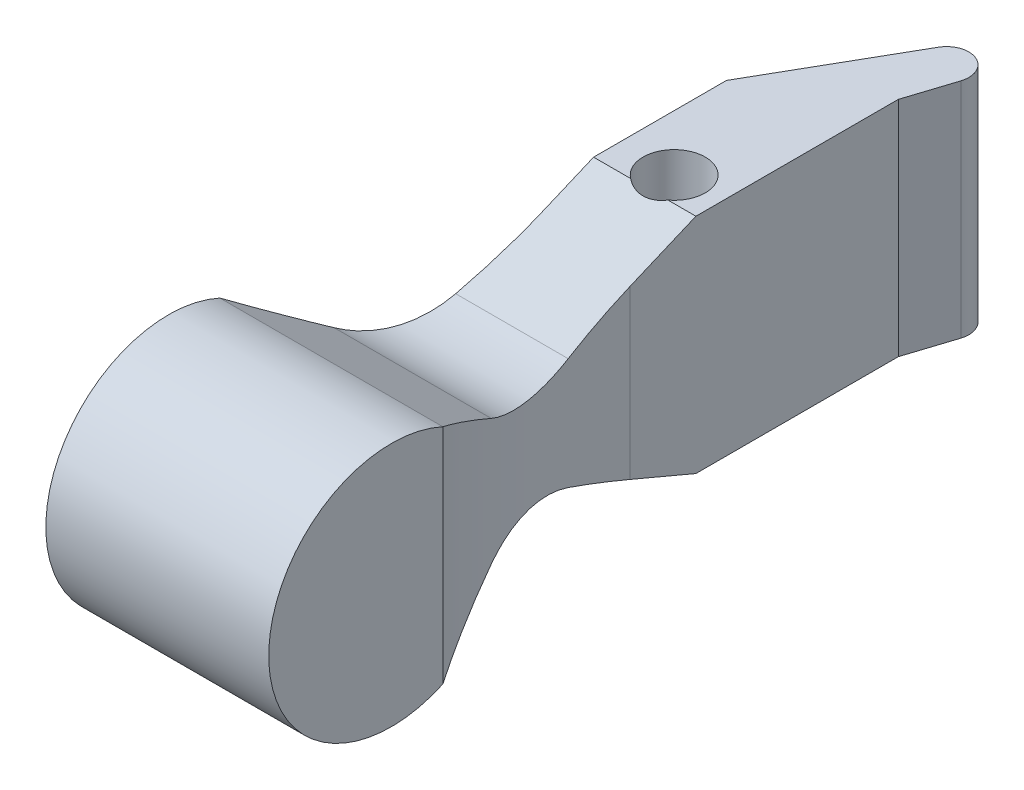
ISO-10303-21;
HEADER;
FILE_DESCRIPTION(('STEP AP214'),'2;1');
FILE_NAME('part.step','',(''),(''),'','','');
FILE_SCHEMA(('AUTOMOTIVE_DESIGN { 1 0 10303 214 1 1 1 1 }'));
ENDSEC;
DATA;
#1=APPLICATION_CONTEXT('core data for automotive mechanical design processes');
#2=APPLICATION_PROTOCOL_DEFINITION('international standard','automotive_design',2000,#1);
#3=PRODUCT_CONTEXT('',#1,'mechanical');
#4=PRODUCT('Part','Part','',(#3));
#5=PRODUCT_RELATED_PRODUCT_CATEGORY('part','',(#4));
#6=PRODUCT_DEFINITION_FORMATION('','',#4);
#7=PRODUCT_DEFINITION_CONTEXT('part definition',#1,'design');
#8=PRODUCT_DEFINITION('design','',#6,#7);
#9=PRODUCT_DEFINITION_SHAPE('','',#8);
#10=(LENGTH_UNIT() NAMED_UNIT(*) SI_UNIT(.MILLI.,.METRE.));
#11=(NAMED_UNIT(*) PLANE_ANGLE_UNIT() SI_UNIT($,.RADIAN.));
#12=(NAMED_UNIT(*) SI_UNIT($,.STERADIAN.) SOLID_ANGLE_UNIT());
#13=UNCERTAINTY_MEASURE_WITH_UNIT(LENGTH_MEASURE(1.E-05),#10,'distance_accuracy_value','');
#14=(GEOMETRIC_REPRESENTATION_CONTEXT(3) GLOBAL_UNCERTAINTY_ASSIGNED_CONTEXT((#13)) GLOBAL_UNIT_ASSIGNED_CONTEXT((#10,
#11,#12)) REPRESENTATION_CONTEXT('',''));
#15=CARTESIAN_POINT('',(0.,0.,0.));
#16=DIRECTION('',(0.,0.,1.));
#17=DIRECTION('',(1.,0.,0.));
#18=AXIS2_PLACEMENT_3D('',#15,#16,#17);
#19=CARTESIAN_POINT('',(0.999134907657391,2.,9.18637032986999));
#20=DIRECTION('',(-1.,0.,0.));
#21=DIRECTION('',(0.,0.,1.));
#22=AXIS2_PLACEMENT_3D('',#19,#20,#21);
#23=PLANE('',#22);
#24=DIRECTION('',(0.,0.389267032224823,-0.921124952231172));
#25=VECTOR('',#24,1.);
#26=CARTESIAN_POINT('',(0.999134907657391,0.00856248977380587,8.3447896435698));
#27=LINE('',#26,#25);
#28=CARTESIAN_POINT('',(0.999134907657391,1.50021824934142,4.81507552310068));
#29=VERTEX_POINT('',#28);
#30=CARTESIAN_POINT('',(0.99913490765739,2.,3.63243891868483));
#31=VERTEX_POINT('',#30);
#32=EDGE_CURVE('E134',#29,#31,#27,.T.);
#33=ORIENTED_EDGE('',*,*,#32,.F.);
#34=DIRECTION('',(0.,1.,0.));
#35=VECTOR('',#34,1.);
#36=CARTESIAN_POINT('',(0.999134907657391,2.,4.81507552310068));
#37=LINE('',#36,#35);
#38=CARTESIAN_POINT('',(0.999134907657391,-1.50021824934142,4.81507552310068));
#39=VERTEX_POINT('',#38);
#40=EDGE_CURVE('E191',#29,#39,#37,.F.);
#41=ORIENTED_EDGE('',*,*,#40,.T.);
#42=DIRECTION('',(0.,-0.389267032224823,-0.921124952231172));
#43=VECTOR('',#42,1.);
#44=CARTESIAN_POINT('',(0.999134907657391,0.59755279973468,9.77904394942284));
#45=LINE('',#44,#43);
#46=CARTESIAN_POINT('',(0.99913490765739,-2.,3.63243891868484));
#47=VERTEX_POINT('',#46);
#48=EDGE_CURVE('E122',#39,#47,#45,.T.);
#49=ORIENTED_EDGE('',*,*,#48,.T.);
#50=DIRECTION('',(0.,0.,-1.));
#51=VECTOR('',#50,1.);
#52=CARTESIAN_POINT('',(0.999134907657391,-2.,9.18637032986999));
#53=LINE('',#52,#51);
#54=CARTESIAN_POINT('',(0.999134907657391,-2.,0.));
#55=VERTEX_POINT('',#54);
#56=EDGE_CURVE('E141',#47,#55,#53,.T.);
#57=ORIENTED_EDGE('',*,*,#56,.T.);
#58=DIRECTION('',(0.,-1.,0.));
#59=VECTOR('',#58,1.);
#60=CARTESIAN_POINT('',(0.999134907657391,2.,0.));
#61=LINE('',#60,#59);
#62=CARTESIAN_POINT('',(0.999134907657391,2.,0.));
#63=VERTEX_POINT('',#62);
#64=EDGE_CURVE('E182',#63,#55,#61,.T.);
#65=ORIENTED_EDGE('',*,*,#64,.F.);
#66=DIRECTION('',(0.,0.,-1.));
#67=VECTOR('',#66,1.);
#68=CARTESIAN_POINT('',(0.999134907657391,2.,9.18637032986999));
#69=LINE('',#68,#67);
#70=EDGE_CURVE('E144',#31,#63,#69,.T.);
#71=ORIENTED_EDGE('',*,*,#70,.F.);
#72=EDGE_LOOP('',(#33,#41,#49,#57,#65,#71));
#73=FACE_BOUND('',#72,.T.);
#74=ADVANCED_FACE('F32',(#73),#23,.F.);
#75=CARTESIAN_POINT('',(-0.837048863818451,2.,1.24760947583977));
#76=DIRECTION('',(1.,0.,0.));
#77=DIRECTION('',(0.,0.,-1.));
#78=AXIS2_PLACEMENT_3D('',#75,#76,#77);
#79=PLANE('',#78);
#80=DIRECTION('',(0.,0.389267032224823,0.921124952231172));
#81=VECTOR('',#80,1.);
#82=CARTESIAN_POINT('',(-0.837048863818451,-2.,3.63243891868484));
#83=LINE('',#82,#81);
#84=CARTESIAN_POINT('',(-0.837048863818451,-2.,3.63243891868484));
#85=VERTEX_POINT('',#84);
#86=CARTESIAN_POINT('',(-0.837048863818451,-1.63534891892601,4.49531499559167));
#87=VERTEX_POINT('',#86);
#88=EDGE_CURVE('E113',#85,#87,#83,.T.);
#89=ORIENTED_EDGE('',*,*,#88,.T.);
#90=DIRECTION('',(0.,1.,0.));
#91=VECTOR('',#90,1.);
#92=CARTESIAN_POINT('',(-0.837048863818451,2.,4.49531499559167));
#93=LINE('',#92,#91);
#94=CARTESIAN_POINT('',(-0.837048863818451,1.63534891892601,4.49531499559167));
#95=VERTEX_POINT('',#94);
#96=EDGE_CURVE('E194',#87,#95,#93,.T.);
#97=ORIENTED_EDGE('',*,*,#96,.T.);
#98=DIRECTION('',(0.,-0.389267032224823,0.921124952231172));
#99=VECTOR('',#98,1.);
#100=CARTESIAN_POINT('',(-0.837048863818451,2.,3.63243891868483));
#101=LINE('',#100,#99);
#102=CARTESIAN_POINT('',(-0.837048863818451,2.,3.63243891868483));
#103=VERTEX_POINT('',#102);
#104=EDGE_CURVE('E109',#103,#95,#101,.T.);
#105=ORIENTED_EDGE('',*,*,#104,.F.);
#106=DIRECTION('',(0.,0.,1.));
#107=VECTOR('',#106,1.);
#108=CARTESIAN_POINT('',(-0.837048863818451,2.,1.24760947583977));
#109=LINE('',#108,#107);
#110=CARTESIAN_POINT('',(-0.837048863818451,2.,1.24760947583977));
#111=VERTEX_POINT('',#110);
#112=EDGE_CURVE('E157',#111,#103,#109,.T.);
#113=ORIENTED_EDGE('',*,*,#112,.F.);
#114=DIRECTION('',(0.,-1.,0.));
#115=VECTOR('',#114,1.);
#116=CARTESIAN_POINT('',(-0.837048863818451,2.,1.24760947583977));
#117=LINE('',#116,#115);
#118=CARTESIAN_POINT('',(-0.837048863818451,-2.,1.24760947583977));
#119=VERTEX_POINT('',#118);
#120=EDGE_CURVE('E160',#111,#119,#117,.T.);
#121=ORIENTED_EDGE('',*,*,#120,.T.);
#122=DIRECTION('',(0.,0.,1.));
#123=VECTOR('',#122,1.);
#124=CARTESIAN_POINT('',(-0.837048863818451,-2.,1.24760947583977));
#125=LINE('',#124,#123);
#126=EDGE_CURVE('E148',#119,#85,#125,.T.);
#127=ORIENTED_EDGE('',*,*,#126,.T.);
#128=EDGE_LOOP('',(#89,#97,#105,#113,#121,#127));
#129=FACE_BOUND('',#128,.T.);
#130=ADVANCED_FACE('F300',(#129),#79,.F.);
#131=CARTESIAN_POINT('',(0.893763052639286,2.,-0.972273036742928));
#132=DIRECTION('',(0.,1.,0.));
#133=DIRECTION('',(0.,0.,1.));
#134=AXIS2_PLACEMENT_3D('',#131,#132,#133);
#135=PLANE('',#134);
#136=ORIENTED_EDGE('',*,*,#112,.T.);
#137=DIRECTION('',(1.,0.,0.));
#138=VECTOR('',#137,1.);
#139=CARTESIAN_POINT('',(-0.837048863818451,2.,3.63243891868483));
#140=LINE('',#139,#138);
#141=CARTESIAN_POINT('',(-0.17221198150248,2.,3.63243891868483));
#142=VERTEX_POINT('',#141);
#143=EDGE_CURVE('E117',#103,#142,#140,.T.);
#144=ORIENTED_EDGE('',*,*,#143,.T.);
#145=CARTESIAN_POINT('',(0.162951136181548,2.,3.18637032986999));
#146=DIRECTION('',(0.,1.,0.));
#147=DIRECTION('',(0.,0.,1.));
#148=AXIS2_PLACEMENT_3D('',#145,#146,#147);
#149=CIRCLE('',#148,0.557952956245364);
#150=CARTESIAN_POINT('',(0.498114253865576,2.,3.63243891868483));
#151=VERTEX_POINT('',#150);
#152=EDGE_CURVE('E138',#151,#142,#149,.T.);
#153=ORIENTED_EDGE('',*,*,#152,.F.);
#154=EDGE_CURVE('E116',#151,#31,#140,.T.);
#155=ORIENTED_EDGE('',*,*,#154,.T.);
#156=ORIENTED_EDGE('',*,*,#70,.T.);
#157=DIRECTION('',(0.306685794926007,0.,-0.951810812709439));
#158=VECTOR('',#157,1.);
#159=CARTESIAN_POINT('',(1.27303719888314,2.,-0.850065985212838));
#160=LINE('',#159,#158);
#161=CARTESIAN_POINT('',(1.27303719888314,2.,-0.850065985212838));
#162=VERTEX_POINT('',#161);
#163=EDGE_CURVE('E147',#63,#162,#160,.T.);
#164=ORIENTED_EDGE('',*,*,#163,.T.);
#165=CARTESIAN_POINT('',(0.893763052639286,2.,-0.972273036742928));
#166=DIRECTION('',(0.,1.,0.));
#167=DIRECTION('',(0.,0.,1.));
#168=AXIS2_PLACEMENT_3D('',#165,#166,#167);
#169=CIRCLE('',#168,0.398476400120111);
#170=CARTESIAN_POINT('',(0.544188203910861,2.,-1.16353428893265));
#171=VERTEX_POINT('',#170);
#172=EDGE_CURVE('E151',#162,#171,#169,.T.);
#173=ORIENTED_EDGE('',*,*,#172,.T.);
#174=DIRECTION('',(-0.497072060501097,0.,0.86770926390652));
#175=VECTOR('',#174,1.);
#176=CARTESIAN_POINT('',(0.544188203910861,2.,-1.16353428893265));
#177=LINE('',#176,#175);
#178=EDGE_CURVE('E154',#171,#111,#177,.T.);
#179=ORIENTED_EDGE('',*,*,#178,.T.);
#180=EDGE_LOOP('',(#136,#144,#153,#155,#156,#164,#173,#179));
#181=FACE_BOUND('',#180,.T.);
#182=ADVANCED_FACE('F310',(#181),#135,.T.);
#183=CARTESIAN_POINT('',(0.893763052639286,-2.,-0.972273036742928));
#184=DIRECTION('',(0.,1.,0.));
#185=DIRECTION('',(0.,0.,1.));
#186=AXIS2_PLACEMENT_3D('',#183,#184,#185);
#187=PLANE('',#186);
#188=ORIENTED_EDGE('',*,*,#56,.F.);
#189=DIRECTION('',(1.,0.,0.));
#190=VECTOR('',#189,1.);
#191=CARTESIAN_POINT('',(-0.837048863818451,-2.,3.63243891868484));
#192=LINE('',#191,#190);
#193=CARTESIAN_POINT('',(0.498114253865572,-2.,3.63243891868484));
#194=VERTEX_POINT('',#193);
#195=EDGE_CURVE('E129',#194,#47,#192,.T.);
#196=ORIENTED_EDGE('',*,*,#195,.F.);
#197=CARTESIAN_POINT('',(0.162951136181548,-2.,3.18637032986999));
#198=DIRECTION('',(0.,1.,0.));
#199=DIRECTION('',(0.,0.,1.));
#200=AXIS2_PLACEMENT_3D('',#197,#198,#199);
#201=CIRCLE('',#200,0.557952956245364);
#202=CARTESIAN_POINT('',(-0.172211981502475,-2.,3.63243891868484));
#203=VERTEX_POINT('',#202);
#204=EDGE_CURVE('E137',#194,#203,#201,.T.);
#205=ORIENTED_EDGE('',*,*,#204,.T.);
#206=EDGE_CURVE('E86',#85,#203,#192,.T.);
#207=ORIENTED_EDGE('',*,*,#206,.F.);
#208=ORIENTED_EDGE('',*,*,#126,.F.);
#209=DIRECTION('',(-0.497072060501097,0.,0.86770926390652));
#210=VECTOR('',#209,1.);
#211=CARTESIAN_POINT('',(0.544188203910861,-2.,-1.16353428893265));
#212=LINE('',#211,#210);
#213=CARTESIAN_POINT('',(0.544188203910861,-2.,-1.16353428893265));
#214=VERTEX_POINT('',#213);
#215=EDGE_CURVE('E169',#214,#119,#212,.T.);
#216=ORIENTED_EDGE('',*,*,#215,.F.);
#217=CARTESIAN_POINT('',(0.893763052639286,-2.,-0.972273036742928));
#218=DIRECTION('',(0.,1.,0.));
#219=DIRECTION('',(0.,0.,1.));
#220=AXIS2_PLACEMENT_3D('',#217,#218,#219);
#221=CIRCLE('',#220,0.398476400120111);
#222=CARTESIAN_POINT('',(1.27303719888314,-2.,-0.850065985212838));
#223=VERTEX_POINT('',#222);
#224=EDGE_CURVE('E166',#223,#214,#221,.T.);
#225=ORIENTED_EDGE('',*,*,#224,.F.);
#226=DIRECTION('',(0.306685794926007,0.,-0.951810812709439));
#227=VECTOR('',#226,1.);
#228=CARTESIAN_POINT('',(1.27303719888314,-2.,-0.850065985212838));
#229=LINE('',#228,#227);
#230=EDGE_CURVE('E163',#55,#223,#229,.T.);
#231=ORIENTED_EDGE('',*,*,#230,.F.);
#232=EDGE_LOOP('',(#188,#196,#205,#207,#208,#216,#225,#231));
#233=FACE_BOUND('',#232,.T.);
#234=ADVANCED_FACE('F340',(#233),#187,.F.);
#235=CARTESIAN_POINT('',(0.162951136181548,2.,3.18637032986999));
#236=DIRECTION('',(0.,-1.,0.));
#237=DIRECTION('',(0.,0.,-1.));
#238=AXIS2_PLACEMENT_3D('',#235,#236,#237);
#239=CYLINDRICAL_SURFACE('',#238,0.557952956245364);
#240=CARTESIAN_POINT('',(0.162951136181548,-2.18850840520178,3.18637032986999));
#241=DIRECTION('',(0.,0.921124952231172,-0.389267032224823));
#242=DIRECTION('',(0.,-0.389267032224823,-0.921124952231172));
#243=AXIS2_PLACEMENT_3D('',#240,#241,#242);
#244=ELLIPSE('',#243,0.605729933701043,0.557952956245364);
#245=EDGE_CURVE('E185',#203,#194,#244,.T.);
#246=ORIENTED_EDGE('',*,*,#245,.F.);
#247=ORIENTED_EDGE('',*,*,#204,.F.);
#248=EDGE_LOOP('',(#246,#247));
#249=FACE_BOUND('',#248,.T.);
#250=ORIENTED_EDGE('',*,*,#152,.T.);
#251=CARTESIAN_POINT('',(0.162951136181548,2.18850840520178,3.18637032986999));
#252=DIRECTION('',(0.,0.921124952231172,0.389267032224823));
#253=DIRECTION('',(0.,-0.389267032224823,0.921124952231172));
#254=AXIS2_PLACEMENT_3D('',#251,#252,#253);
#255=ELLIPSE('',#254,0.605729933701043,0.557952956245364);
#256=EDGE_CURVE('E188',#142,#151,#255,.T.);
#257=ORIENTED_EDGE('',*,*,#256,.T.);
#258=EDGE_LOOP('',(#250,#257));
#259=FACE_BOUND('',#258,.T.);
#260=ADVANCED_FACE('F314',(#249,#259),#239,.F.);
#261=CARTESIAN_POINT('',(1.27303719888314,2.,-0.850065985212838));
#262=DIRECTION('',(-0.951810812709439,0.,-0.306685794926007));
#263=DIRECTION('',(-0.306685794926007,0.,0.951810812709439));
#264=AXIS2_PLACEMENT_3D('',#261,#262,#263);
#265=PLANE('',#264);
#266=ORIENTED_EDGE('',*,*,#230,.T.);
#267=DIRECTION('',(0.,-1.,0.));
#268=VECTOR('',#267,1.);
#269=CARTESIAN_POINT('',(1.27303719888314,2.,-0.850065985212838));
#270=LINE('',#269,#268);
#271=EDGE_CURVE('E179',#162,#223,#270,.T.);
#272=ORIENTED_EDGE('',*,*,#271,.F.);
#273=ORIENTED_EDGE('',*,*,#163,.F.);
#274=ORIENTED_EDGE('',*,*,#64,.T.);
#275=EDGE_LOOP('',(#266,#272,#273,#274));
#276=FACE_BOUND('',#275,.T.);
#277=ADVANCED_FACE('F357',(#276),#265,.F.);
#278=CARTESIAN_POINT('',(0.893763052639286,2.,-0.972273036742928));
#279=DIRECTION('',(0.,-1.,0.));
#280=DIRECTION('',(0.,0.,-1.));
#281=AXIS2_PLACEMENT_3D('',#278,#279,#280);
#282=CYLINDRICAL_SURFACE('',#281,0.398476400120111);
#283=ORIENTED_EDGE('',*,*,#224,.T.);
#284=DIRECTION('',(0.,-1.,0.));
#285=VECTOR('',#284,1.);
#286=CARTESIAN_POINT('',(0.544188203910861,2.,-1.16353428893265));
#287=LINE('',#286,#285);
#288=EDGE_CURVE('E176',#171,#214,#287,.T.);
#289=ORIENTED_EDGE('',*,*,#288,.F.);
#290=ORIENTED_EDGE('',*,*,#172,.F.);
#291=ORIENTED_EDGE('',*,*,#271,.T.);
#292=EDGE_LOOP('',(#283,#289,#290,#291));
#293=FACE_BOUND('',#292,.T.);
#294=ADVANCED_FACE('F352',(#293),#282,.T.);
#295=CARTESIAN_POINT('',(0.544188203910861,2.,-1.16353428893265));
#296=DIRECTION('',(0.86770926390652,0.,0.497072060501097));
#297=DIRECTION('',(0.497072060501097,0.,-0.86770926390652));
#298=AXIS2_PLACEMENT_3D('',#295,#296,#297);
#299=PLANE('',#298);
#300=ORIENTED_EDGE('',*,*,#215,.T.);
#301=ORIENTED_EDGE('',*,*,#120,.F.);
#302=ORIENTED_EDGE('',*,*,#178,.F.);
#303=ORIENTED_EDGE('',*,*,#288,.T.);
#304=EDGE_LOOP('',(#300,#301,#302,#303));
#305=FACE_BOUND('',#304,.T.);
#306=ADVANCED_FACE('F347',(#305),#299,.F.);
#307=CARTESIAN_POINT('',(-0.837048863818451,-1.13453360530739,7.74595257535492));
#308=DIRECTION('',(0.,0.855485100376599,0.517827425918752));
#309=DIRECTION('',(0.,-0.517827425918752,0.855485100376599));
#310=AXIS2_PLACEMENT_3D('',#307,#308,#309);
#311=PLANE('',#310);
#312=DIRECTION('',(1.,0.,0.));
#313=VECTOR('',#312,1.);
#314=CARTESIAN_POINT('',(-0.837048863818451,-2.,9.17576020715916));
#315=LINE('',#314,#313);
#316=CARTESIAN_POINT('',(-2.,-2.,9.17576020715916));
#317=VERTEX_POINT('',#316);
#318=CARTESIAN_POINT('',(2.,-2.,9.17576020715916));
#319=VERTEX_POINT('',#318);
#320=EDGE_CURVE('E75',#317,#319,#315,.T.);
#321=ORIENTED_EDGE('',*,*,#320,.F.);
#322=CARTESIAN_POINT('',(-10.8370488638184,0.833086040882305,4.49531499559167));
#323=DIRECTION('',(0.,0.855485100376599,0.517827425918752));
#324=DIRECTION('',(0.,0.517827425918752,-0.855485100376599));
#325=AXIS2_PLACEMENT_3D('',#322,#323,#324);
#326=ELLIPSE('',#325,11.6892743024955,10.);
#327=CARTESIAN_POINT('',(-1.38012783607206,-1.13453360530739,7.74595257535492));
#328=VERTEX_POINT('',#327);
#329=EDGE_CURVE('E79',#317,#328,#326,.T.);
#330=ORIENTED_EDGE('',*,*,#329,.T.);
#331=DIRECTION('',(1.,0.,0.));
#332=VECTOR('',#331,1.);
#333=CARTESIAN_POINT('',(-0.837048863818451,-1.13453360530739,7.74595257535492));
#334=LINE('',#333,#332);
#335=CARTESIAN_POINT('',(1.43827931286,-1.13453360530739,7.74595257535492));
#336=VERTEX_POINT('',#335);
#337=EDGE_CURVE('E85',#328,#336,#334,.T.);
#338=ORIENTED_EDGE('',*,*,#337,.T.);
#339=CARTESIAN_POINT('',(10.9991349076574,0.639534135890014,4.81507552310068));
#340=DIRECTION('',(0.,0.855485100376599,0.517827425918752));
#341=DIRECTION('',(0.,0.517827425918752,-0.855485100376599));
#342=AXIS2_PLACEMENT_3D('',#339,#340,#341);
#343=ELLIPSE('',#342,11.6892743024955,10.);
#344=EDGE_CURVE('E82',#336,#319,#343,.T.);
#345=ORIENTED_EDGE('',*,*,#344,.T.);
#346=EDGE_LOOP('',(#321,#330,#338,#345));
#347=FACE_BOUND('',#346,.T.);
#348=ADVANCED_FACE('F77',(#347),#311,.F.);
#349=CARTESIAN_POINT('',(-0.837048863818451,-2.76925998303883,6.7413030535878));
#350=DIRECTION('',(1.,0.,0.));
#351=DIRECTION('',(0.,0.,-1.));
#352=AXIS2_PLACEMENT_3D('',#349,#350,#351);
#353=CYLINDRICAL_SURFACE('',#352,1.91876288051386);
#354=ORIENTED_EDGE('',*,*,#337,.F.);
#355=CARTESIAN_POINT('',(-1.38012783607206,-1.1345336053075,7.74595257535509));
#356=CARTESIAN_POINT('',(-1.36392521595843,-1.10557058825964,7.69881887315142));
#357=CARTESIAN_POINT('',(-1.34770033738258,-1.0786598313217,7.65046483026204));
#358=CARTESIAN_POINT('',(-1.31538927528563,-1.02909299119863,7.55157164036878));
#359=CARTESIAN_POINT('',(-1.29930310775781,-1.00643739253356,7.50103224533152));
#360=CARTESIAN_POINT('',(-1.25151849692167,-0.945069045234941,7.34648873438207));
#361=CARTESIAN_POINT('',(-1.22030917043666,-0.912981636179527,7.23960307192807));
#362=CARTESIAN_POINT('',(-1.16060009200851,-0.867708371743593,7.0210249201196));
#363=CARTESIAN_POINT('',(-1.13210476353859,-0.854552896852139,6.90932500034694));
#364=CARTESIAN_POINT('',(-1.07895432144437,-0.848055576257672,6.68457849280942));
#365=CARTESIAN_POINT('',(-1.05429227586545,-0.854677516783541,6.57153474341992));
#366=CARTESIAN_POINT('',(-1.01594820983596,-0.883081027353639,6.38013905348761));
#367=CARTESIAN_POINT('',(-1.00115687411181,-0.899904754809574,6.30124102117113));
#368=CARTESIAN_POINT('',(-0.973865683160829,-0.94346877285008,6.14575086970297));
#369=CARTESIAN_POINT('',(-0.961367786651416,-0.970217481520185,6.06916076786805));
#370=CARTESIAN_POINT('',(-0.950048895675013,-1.00183961638255,5.99439192154701));
#371=B_SPLINE_CURVE_WITH_KNOTS('',3,(#355,#356,#357,#358,#359,#360,#361,#362,#363,#364,#365,
#366,#367,#368,#369,#370),.UNSPECIFIED.,.F.,.F.,(4,2,2,2,2,2,2,4),(0.,0.172831491348305,
0.345682650501704,0.691543743961004,1.03795923175934,1.383740798738,1.62916118867779,
1.87479021479048),.UNSPECIFIED.);
#372=CARTESIAN_POINT('',(-0.950048895675014,-1.00183961638255,5.99439192154701));
#373=VERTEX_POINT('',#372);
#374=EDGE_CURVE('E96',#328,#373,#371,.T.);
#375=ORIENTED_EDGE('',*,*,#374,.T.);
#376=DIRECTION('',(1.,0.,0.));
#377=VECTOR('',#376,1.);
#378=CARTESIAN_POINT('',(-0.837048863818451,-1.00183961638255,5.99439192154701));
#379=LINE('',#378,#377);
#380=CARTESIAN_POINT('',(1.06891774828189,-1.00183961638255,5.99439192154701));
#381=VERTEX_POINT('',#380);
#382=EDGE_CURVE('E123',#373,#381,#379,.T.);
#383=ORIENTED_EDGE('',*,*,#382,.T.);
#384=CARTESIAN_POINT('',(1.06891774828189,-1.00183961638255,5.99439192154701));
#385=CARTESIAN_POINT('',(1.07483158834844,-0.980788395515751,6.04420411711503));
#386=CARTESIAN_POINT('',(1.08122685422722,-0.96187665230035,6.09483322286334));
#387=CARTESIAN_POINT('',(1.09499827657234,-0.928417017914626,6.19737427035536));
#388=CARTESIAN_POINT('',(1.1023742698181,-0.913868401906233,6.24928599746692));
#389=CARTESIAN_POINT('',(1.12594511523416,-0.876976594101418,6.4060553302131));
#390=CARTESIAN_POINT('',(1.14362646219003,-0.861230136547447,6.51232183884913));
#391=CARTESIAN_POINT('',(1.18267126748866,-0.847594778859862,6.72525408757025));
#392=CARTESIAN_POINT('',(1.20403507030538,-0.849707550250225,6.83191986409069));
#393=CARTESIAN_POINT('',(1.24984572397137,-0.871378043692391,7.04285811482403));
#394=CARTESIAN_POINT('',(1.2742941997038,-0.890944993128404,7.14712929318852));
#395=CARTESIAN_POINT('',(1.32181994092657,-0.942888791965784,7.33653238712111));
#396=CARTESIAN_POINT('',(1.34462455514427,-0.973137867096609,7.4223264183682));
#397=CARTESIAN_POINT('',(1.39103497380491,-1.04528319695402,7.58851646826823));
#398=CARTESIAN_POINT('',(1.41463983533641,-1.08716613571425,7.6689185286558));
#399=CARTESIAN_POINT('',(1.43827931286001,-1.13453360530751,7.74595257535511));
#400=B_SPLINE_CURVE_WITH_KNOTS('',3,(#384,#385,#386,#387,#388,#389,#390,#391,#392,#393,#394,
#395,#396,#397,#398,#399),.UNSPECIFIED.,.F.,.F.,(4,2,2,2,2,2,2,4),(0.,0.163096483715721,
0.326165857492861,0.651094311194819,0.976053176720029,1.30118393796882,1.58167222931864,
1.86184079107071),.UNSPECIFIED.);
#401=EDGE_CURVE('E247',#381,#336,#400,.T.);
#402=ORIENTED_EDGE('',*,*,#401,.T.);
#403=EDGE_LOOP('',(#354,#375,#383,#402));
#404=FACE_BOUND('',#403,.T.);
#405=ADVANCED_FACE('F239',(#404),#353,.F.);
#406=CARTESIAN_POINT('',(-0.837048863818451,-2.,3.63243891868484));
#407=DIRECTION('',(0.,0.921124952231172,-0.389267032224823));
#408=DIRECTION('',(0.,0.389267032224823,0.921124952231172));
#409=AXIS2_PLACEMENT_3D('',#406,#407,#408);
#410=PLANE('',#409);
#411=ORIENTED_EDGE('',*,*,#382,.F.);
#412=CARTESIAN_POINT('',(-10.8370488638184,-1.63534891892601,4.49531499559167));
#413=DIRECTION('',(0.,0.921124952231172,-0.389267032224823));
#414=DIRECTION('',(0.,0.389267032224823,0.921124952231172));
#415=AXIS2_PLACEMENT_3D('',#412,#413,#414);
#416=ELLIPSE('',#415,10.8562904259381,10.);
#417=EDGE_CURVE('E231',#373,#87,#416,.T.);
#418=ORIENTED_EDGE('',*,*,#417,.T.);
#419=ORIENTED_EDGE('',*,*,#88,.F.);
#420=ORIENTED_EDGE('',*,*,#206,.T.);
#421=ORIENTED_EDGE('',*,*,#245,.T.);
#422=ORIENTED_EDGE('',*,*,#195,.T.);
#423=ORIENTED_EDGE('',*,*,#48,.F.);
#424=CARTESIAN_POINT('',(10.9991349076574,-1.50021824934142,4.81507552310068));
#425=DIRECTION('',(0.,0.921124952231172,-0.389267032224823));
#426=DIRECTION('',(0.,0.389267032224823,0.921124952231172));
#427=AXIS2_PLACEMENT_3D('',#424,#425,#426);
#428=ELLIPSE('',#427,10.8562904259381,10.);
#429=EDGE_CURVE('E253',#39,#381,#428,.T.);
#430=ORIENTED_EDGE('',*,*,#429,.T.);
#431=EDGE_LOOP('',(#411,#418,#419,#420,#421,#422,#423,#430));
#432=FACE_BOUND('',#431,.T.);
#433=ADVANCED_FACE('F218',(#432),#410,.F.);
#434=CARTESIAN_POINT('',(-0.837048863818451,2.76925998303883,6.7413030535878));
#435=DIRECTION('',(1.,0.,0.));
#436=DIRECTION('',(0.,0.,-1.));
#437=AXIS2_PLACEMENT_3D('',#434,#435,#436);
#438=CYLINDRICAL_SURFACE('',#437,1.91876288051386);
#439=DIRECTION('',(1.,0.,0.));
#440=VECTOR('',#439,1.);
#441=CARTESIAN_POINT('',(-0.837048863818451,1.13453360530739,7.74595257535492));
#442=LINE('',#441,#440);
#443=CARTESIAN_POINT('',(-1.38012783607204,1.13453360530739,7.74595257535492));
#444=VERTEX_POINT('',#443);
#445=CARTESIAN_POINT('',(1.43827931285998,1.13453360530739,7.74595257535492));
#446=VERTEX_POINT('',#445);
#447=EDGE_CURVE('E56',#444,#446,#442,.T.);
#448=ORIENTED_EDGE('',*,*,#447,.T.);
#449=CARTESIAN_POINT('',(1.43827931285998,1.13453360530748,7.74595257535506));
#450=CARTESIAN_POINT('',(1.42395303663668,1.10581813193893,7.69922259833032));
#451=CARTESIAN_POINT('',(1.40963435859316,1.0791160165517,7.65128498910565));
#452=CARTESIAN_POINT('',(1.38118289730659,1.02989059406488,7.55325088219501));
#453=CARTESIAN_POINT('',(1.36705013422061,1.00736773667101,7.50315415289252));
#454=CARTESIAN_POINT('',(1.32518962292486,0.946302188124311,7.35001869161236));
#455=CARTESIAN_POINT('',(1.29800159289013,0.914266359250961,7.24414093545604));
#456=CARTESIAN_POINT('',(1.24635288949271,0.868760220031761,7.02768850263441));
#457=CARTESIAN_POINT('',(1.22189657468229,0.855319200132446,6.91710669790846));
#458=CARTESIAN_POINT('',(1.17670908800023,0.847848789777549,6.6946476943705));
#459=CARTESIAN_POINT('',(1.15597201175749,0.853788339271179,6.58277285433172));
#460=CARTESIAN_POINT('',(1.12363742456542,0.881066613294436,6.39032593617087));
#461=CARTESIAN_POINT('',(1.11107046406842,0.897945640695648,6.30925783953742));
#462=CARTESIAN_POINT('',(1.08824965258183,0.942122385540632,6.14960158229096));
#463=CARTESIAN_POINT('',(1.07799779316413,0.969429019437229,6.07101560653162));
#464=CARTESIAN_POINT('',(1.06891774828189,1.00183961638255,5.99439192154701));
#465=B_SPLINE_CURVE_WITH_KNOTS('',3,(#449,#450,#451,#452,#453,#454,#455,#456,#457,#458,#459,
#460,#461,#462,#463,#464),.UNSPECIFIED.,.F.,.F.,(4,2,2,2,2,2,2,4),(0.,0.169961717628384,
0.33994171325973,0.679924181905354,1.020441581739,1.36041352341021,1.61099337532445,
1.86178797494938),.UNSPECIFIED.);
#466=CARTESIAN_POINT('',(1.06891774828189,1.00183961638255,5.99439192154701));
#467=VERTEX_POINT('',#466);
#468=EDGE_CURVE('E199',#446,#467,#465,.T.);
#469=ORIENTED_EDGE('',*,*,#468,.T.);
#470=DIRECTION('',(1.,0.,0.));
#471=VECTOR('',#470,1.);
#472=CARTESIAN_POINT('',(-0.837048863818451,1.00183961638255,5.99439192154701));
#473=LINE('',#472,#471);
#474=CARTESIAN_POINT('',(-0.950048895675013,1.00183961638255,5.99439192154701));
#475=VERTEX_POINT('',#474);
#476=EDGE_CURVE('E112',#475,#467,#473,.T.);
#477=ORIENTED_EDGE('',*,*,#476,.F.);
#478=CARTESIAN_POINT('',(-0.950048895675013,1.00183961638255,5.99439192154701));
#479=CARTESIAN_POINT('',(-0.957648209483415,0.980652472521812,6.04452545395375));
#480=CARTESIAN_POINT('',(-0.965764875622304,0.961640326113284,6.09546840334479));
#481=CARTESIAN_POINT('',(-0.983038787094266,0.928043275578051,6.19861040005223));
#482=CARTESIAN_POINT('',(-0.992195816868943,0.913457456628179,6.25080918540508));
#483=CARTESIAN_POINT('',(-1.02116585429629,0.876539631488257,6.40836684608155));
#484=CARTESIAN_POINT('',(-1.04253692376343,0.860881201372637,6.51508308518883));
#485=CARTESIAN_POINT('',(-1.08903033573147,0.847550216544568,6.72872253084606));
#486=CARTESIAN_POINT('',(-1.11415222189372,0.849875475613841,6.83564571065899));
#487=CARTESIAN_POINT('',(-1.1674589461601,0.872022800648136,7.04696394532875));
#488=CARTESIAN_POINT('',(-1.19564568082247,0.891855755198257,7.15135738534065));
#489=CARTESIAN_POINT('',(-1.24979012144109,0.944082405592158,7.34007258440577));
#490=CARTESIAN_POINT('',(-1.27547578992393,0.974229747198854,7.42510535717931));
#491=CARTESIAN_POINT('',(-1.32749994052023,1.04597269239985,7.58983417557966));
#492=CARTESIAN_POINT('',(-1.3538374741991,1.08755246171527,7.66953741433652));
#493=CARTESIAN_POINT('',(-1.38012783607214,1.13453360530745,7.74595257535502));
#494=B_SPLINE_CURVE_WITH_KNOTS('',3,(#478,#479,#480,#481,#482,#483,#484,#485,#486,#487,#488,
#489,#490,#491,#492,#493),.UNSPECIFIED.,.F.,.F.,(4,2,2,2,2,2,2,4),(0.,0.164757213847831,
0.329480352826639,0.657643153888779,0.985766061899555,1.31409318372835,1.5946684514237,
1.87485705409862),.UNSPECIFIED.);
#495=EDGE_CURVE('E41',#475,#444,#494,.T.);
#496=ORIENTED_EDGE('',*,*,#495,.T.);
#497=EDGE_LOOP('',(#448,#469,#477,#496));
#498=FACE_BOUND('',#497,.T.);
#499=ADVANCED_FACE('F212',(#498),#438,.F.);
#500=CARTESIAN_POINT('',(-0.837048863818451,1.13453360530739,7.74595257535492));
#501=DIRECTION('',(0.,0.855485100376599,-0.517827425918752));
#502=DIRECTION('',(0.,0.517827425918752,0.855485100376599));
#503=AXIS2_PLACEMENT_3D('',#500,#501,#502);
#504=PLANE('',#503);
#505=DIRECTION('',(1.,0.,0.));
#506=VECTOR('',#505,1.);
#507=CARTESIAN_POINT('',(-0.837048863818451,2.,9.17576020715916));
#508=LINE('',#507,#506);
#509=CARTESIAN_POINT('',(-2.,2.,9.17576020715916));
#510=VERTEX_POINT('',#509);
#511=CARTESIAN_POINT('',(2.,2.,9.17576020715916));
#512=VERTEX_POINT('',#511);
#513=EDGE_CURVE('E48',#510,#512,#508,.T.);
#514=ORIENTED_EDGE('',*,*,#513,.T.);
#515=CARTESIAN_POINT('',(10.9991349076574,-0.639534135890013,4.81507552310068));
#516=DIRECTION('',(0.,0.855485100376599,-0.517827425918752));
#517=DIRECTION('',(0.,0.517827425918752,0.855485100376599));
#518=AXIS2_PLACEMENT_3D('',#515,#516,#517);
#519=ELLIPSE('',#518,11.6892743024955,10.);
#520=EDGE_CURVE('E197',#512,#446,#519,.F.);
#521=ORIENTED_EDGE('',*,*,#520,.T.);
#522=ORIENTED_EDGE('',*,*,#447,.F.);
#523=CARTESIAN_POINT('',(-10.8370488638184,-0.833086040882304,4.49531499559167));
#524=DIRECTION('',(0.,0.855485100376599,-0.517827425918752));
#525=DIRECTION('',(0.,0.517827425918752,0.855485100376599));
#526=AXIS2_PLACEMENT_3D('',#523,#524,#525);
#527=ELLIPSE('',#526,11.6892743024955,10.);
#528=EDGE_CURVE('E11',#444,#510,#527,.F.);
#529=ORIENTED_EDGE('',*,*,#528,.T.);
#530=EDGE_LOOP('',(#514,#521,#522,#529));
#531=FACE_BOUND('',#530,.T.);
#532=ADVANCED_FACE('F217',(#531),#504,.T.);
#533=CARTESIAN_POINT('',(-0.837048863818451,2.,3.63243891868483));
#534=DIRECTION('',(0.,0.921124952231172,0.389267032224823));
#535=DIRECTION('',(0.,-0.389267032224823,0.921124952231172));
#536=AXIS2_PLACEMENT_3D('',#533,#534,#535);
#537=PLANE('',#536);
#538=ORIENTED_EDGE('',*,*,#476,.T.);
#539=CARTESIAN_POINT('',(10.9991349076574,1.50021824934142,4.81507552310068));
#540=DIRECTION('',(0.,0.921124952231172,0.389267032224823));
#541=DIRECTION('',(0.,0.389267032224823,-0.921124952231172));
#542=AXIS2_PLACEMENT_3D('',#539,#540,#541);
#543=ELLIPSE('',#542,10.8562904259381,10.);
#544=EDGE_CURVE('E207',#467,#29,#543,.F.);
#545=ORIENTED_EDGE('',*,*,#544,.T.);
#546=ORIENTED_EDGE('',*,*,#32,.T.);
#547=ORIENTED_EDGE('',*,*,#154,.F.);
#548=ORIENTED_EDGE('',*,*,#256,.F.);
#549=ORIENTED_EDGE('',*,*,#143,.F.);
#550=ORIENTED_EDGE('',*,*,#104,.T.);
#551=CARTESIAN_POINT('',(-10.8370488638184,1.63534891892601,4.49531499559167));
#552=DIRECTION('',(0.,0.921124952231172,0.389267032224823));
#553=DIRECTION('',(0.,0.389267032224823,-0.921124952231172));
#554=AXIS2_PLACEMENT_3D('',#551,#552,#553);
#555=ELLIPSE('',#554,10.8562904259381,10.);
#556=EDGE_CURVE('E228',#95,#475,#555,.F.);
#557=ORIENTED_EDGE('',*,*,#556,.T.);
#558=EDGE_LOOP('',(#538,#545,#546,#547,#548,#549,#550,#557));
#559=FACE_BOUND('',#558,.T.);
#560=ADVANCED_FACE('F266',(#559),#537,.T.);
#561=CARTESIAN_POINT('',(2.,0.,10.0977324661757));
#562=DIRECTION('',(-1.,0.,0.));
#563=DIRECTION('',(0.,0.,1.));
#564=AXIS2_PLACEMENT_3D('',#561,#562,#563);
#565=CYLINDRICAL_SURFACE('',#564,2.20227901193198);
#566=CARTESIAN_POINT('',(-2.,0.,10.0977324661757));
#567=DIRECTION('',(1.,0.,0.));
#568=DIRECTION('',(0.,0.,-1.));
#569=AXIS2_PLACEMENT_3D('',#566,#567,#568);
#570=CIRCLE('',#569,2.20227901193198);
#571=EDGE_CURVE('E100',#510,#317,#570,.T.);
#572=ORIENTED_EDGE('',*,*,#571,.T.);
#573=ORIENTED_EDGE('',*,*,#320,.T.);
#574=CARTESIAN_POINT('',(2.,0.,10.0977324661757));
#575=DIRECTION('',(1.,0.,0.));
#576=DIRECTION('',(0.,0.,-1.));
#577=AXIS2_PLACEMENT_3D('',#574,#575,#576);
#578=CIRCLE('',#577,2.20227901193198);
#579=EDGE_CURVE('E101',#512,#319,#578,.T.);
#580=ORIENTED_EDGE('',*,*,#579,.F.);
#581=ORIENTED_EDGE('',*,*,#513,.F.);
#582=EDGE_LOOP('',(#572,#573,#580,#581));
#583=FACE_BOUND('',#582,.T.);
#584=ADVANCED_FACE('F103',(#583),#565,.T.);
#585=CARTESIAN_POINT('',(2.,0.,10.0977324661757));
#586=DIRECTION('',(1.,0.,0.));
#587=DIRECTION('',(0.,0.,-1.));
#588=AXIS2_PLACEMENT_3D('',#585,#586,#587);
#589=PLANE('',#588);
#590=ORIENTED_EDGE('',*,*,#579,.T.);
#591=DIRECTION('',(0.,1.,0.));
#592=VECTOR('',#591,1.);
#593=CARTESIAN_POINT('',(2.,2.,9.17576020715916));
#594=LINE('',#593,#592);
#595=EDGE_CURVE('E106',#319,#512,#594,.T.);
#596=ORIENTED_EDGE('',*,*,#595,.T.);
#597=EDGE_LOOP('',(#590,#596));
#598=FACE_BOUND('',#597,.T.);
#599=ADVANCED_FACE('F449',(#598),#589,.T.);
#600=CARTESIAN_POINT('',(-2.,0.,10.0977324661757));
#601=DIRECTION('',(1.,0.,0.));
#602=DIRECTION('',(0.,0.,-1.));
#603=AXIS2_PLACEMENT_3D('',#600,#601,#602);
#604=PLANE('',#603);
#605=ORIENTED_EDGE('',*,*,#571,.F.);
#606=DIRECTION('',(0.,1.,0.));
#607=VECTOR('',#606,1.);
#608=CARTESIAN_POINT('',(-2.,2.,9.17576020715916));
#609=LINE('',#608,#607);
#610=EDGE_CURVE('E93',#317,#510,#609,.T.);
#611=ORIENTED_EDGE('',*,*,#610,.F.);
#612=EDGE_LOOP('',(#605,#611));
#613=FACE_BOUND('',#612,.T.);
#614=ADVANCED_FACE('F99',(#613),#604,.F.);
#615=CARTESIAN_POINT('',(10.9991349076574,2.,4.81507552310068));
#616=DIRECTION('',(0.,1.,0.));
#617=DIRECTION('',(0.,0.,1.));
#618=AXIS2_PLACEMENT_3D('',#615,#616,#617);
#619=CYLINDRICAL_SURFACE('',#618,10.);
#620=ORIENTED_EDGE('',*,*,#429,.F.);
#621=ORIENTED_EDGE('',*,*,#40,.F.);
#622=ORIENTED_EDGE('',*,*,#544,.F.);
#623=ORIENTED_EDGE('',*,*,#468,.F.);
#624=ORIENTED_EDGE('',*,*,#520,.F.);
#625=ORIENTED_EDGE('',*,*,#595,.F.);
#626=ORIENTED_EDGE('',*,*,#344,.F.);
#627=ORIENTED_EDGE('',*,*,#401,.F.);
#628=EDGE_LOOP('',(#620,#621,#622,#623,#624,#625,#626,#627));
#629=FACE_BOUND('',#628,.T.);
#630=ADVANCED_FACE('F209',(#629),#619,.F.);
#631=CARTESIAN_POINT('',(-10.8370488638184,2.,4.49531499559167));
#632=DIRECTION('',(0.,1.,0.));
#633=DIRECTION('',(0.,0.,1.));
#634=AXIS2_PLACEMENT_3D('',#631,#632,#633);
#635=CYLINDRICAL_SURFACE('',#634,10.);
#636=ORIENTED_EDGE('',*,*,#556,.F.);
#637=ORIENTED_EDGE('',*,*,#96,.F.);
#638=ORIENTED_EDGE('',*,*,#417,.F.);
#639=ORIENTED_EDGE('',*,*,#374,.F.);
#640=ORIENTED_EDGE('',*,*,#329,.F.);
#641=ORIENTED_EDGE('',*,*,#610,.T.);
#642=ORIENTED_EDGE('',*,*,#528,.F.);
#643=ORIENTED_EDGE('',*,*,#495,.F.);
#644=EDGE_LOOP('',(#636,#637,#638,#639,#640,#641,#642,#643));
#645=FACE_BOUND('',#644,.T.);
#646=ADVANCED_FACE('F34',(#645),#635,.F.);
#647=CLOSED_SHELL('',(#74,#130,#182,#234,#260,#277,#294,#306,#348,#405,#433,#499,#532,#560,#584,
#599,#614,#630,#646));
#648=MANIFOLD_SOLID_BREP('B2',#647);
#649=ADVANCED_BREP_SHAPE_REPRESENTATION('',(#18,#648),#14);
#650=SHAPE_DEFINITION_REPRESENTATION(#9,#649);
ENDSEC;
END-ISO-10303-21;
